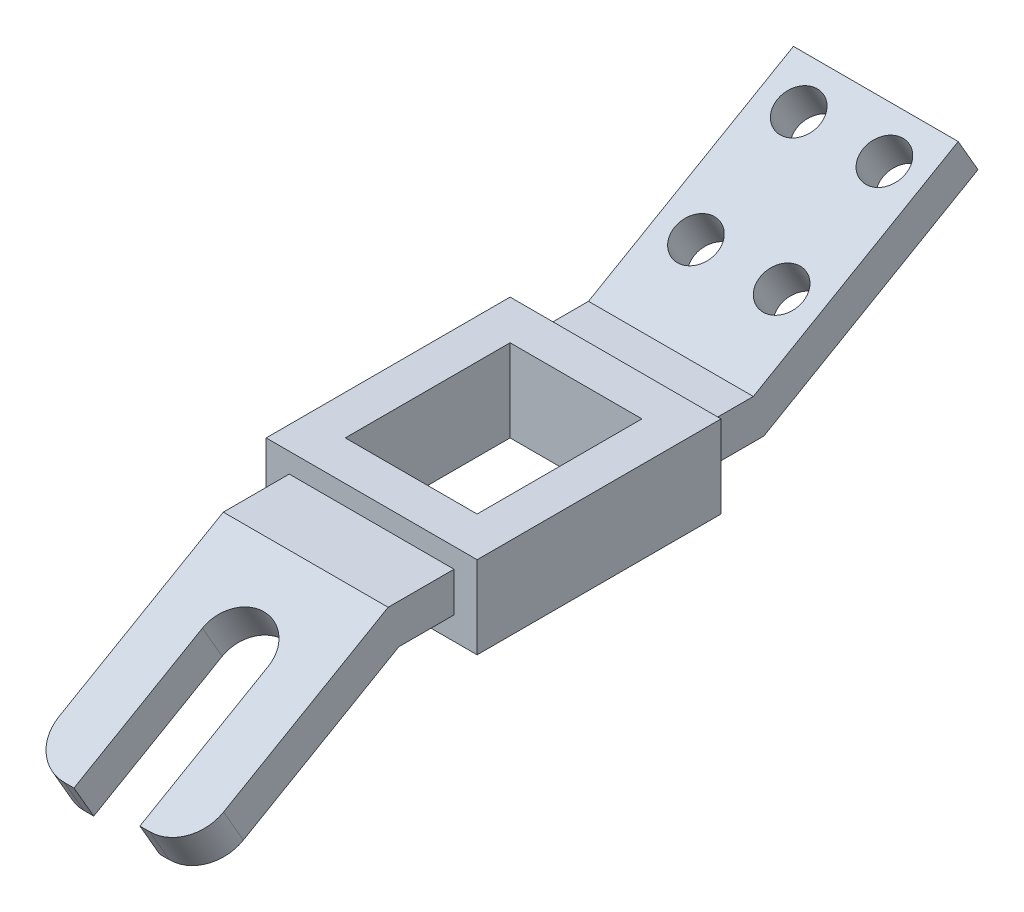
ISO-10303-21;
HEADER;
FILE_DESCRIPTION(('STEP AP214'),'2;1');
FILE_NAME('part.step','',(''),(''),'','','');
FILE_SCHEMA(('AUTOMOTIVE_DESIGN { 1 0 10303 214 1 1 1 1 }'));
ENDSEC;
DATA;
#1=APPLICATION_CONTEXT('core data for automotive mechanical design processes');
#2=APPLICATION_PROTOCOL_DEFINITION('international standard','automotive_design',2000,#1);
#3=PRODUCT_CONTEXT('',#1,'mechanical');
#4=PRODUCT('Part','Part','',(#3));
#5=PRODUCT_RELATED_PRODUCT_CATEGORY('part','',(#4));
#6=PRODUCT_DEFINITION_FORMATION('','',#4);
#7=PRODUCT_DEFINITION_CONTEXT('part definition',#1,'design');
#8=PRODUCT_DEFINITION('design','',#6,#7);
#9=PRODUCT_DEFINITION_SHAPE('','',#8);
#10=(LENGTH_UNIT() NAMED_UNIT(*) SI_UNIT(.MILLI.,.METRE.));
#11=(NAMED_UNIT(*) PLANE_ANGLE_UNIT() SI_UNIT($,.RADIAN.));
#12=(NAMED_UNIT(*) SI_UNIT($,.STERADIAN.) SOLID_ANGLE_UNIT());
#13=UNCERTAINTY_MEASURE_WITH_UNIT(LENGTH_MEASURE(1.E-05),#10,'distance_accuracy_value','');
#14=(GEOMETRIC_REPRESENTATION_CONTEXT(3) GLOBAL_UNCERTAINTY_ASSIGNED_CONTEXT((#13)) GLOBAL_UNIT_ASSIGNED_CONTEXT((#10,
#11,#12)) REPRESENTATION_CONTEXT('',''));
#15=CARTESIAN_POINT('',(0.,0.,0.));
#16=DIRECTION('',(0.,0.,1.));
#17=DIRECTION('',(1.,0.,0.));
#18=AXIS2_PLACEMENT_3D('',#15,#16,#17);
#19=CARTESIAN_POINT('',(25.,-15.821394909424,117.312425173542));
#20=DIRECTION('',(0.,0.500000000000001,-0.866025403784438));
#21=DIRECTION('',(0.,0.866025403784438,0.500000000000001));
#22=AXIS2_PLACEMENT_3D('',#19,#20,#21);
#23=PLANE('',#22);
#24=DIRECTION('',(-1.,0.,0.));
#25=VECTOR('',#24,1.);
#26=CARTESIAN_POINT('',(25.,-15.821394909424,117.312425173542));
#27=LINE('',#26,#25);
#28=CARTESIAN_POINT('',(13.,-15.821394909424,117.312425173542));
#29=VERTEX_POINT('',#28);
#30=CARTESIAN_POINT('',(10.,-15.821394909424,117.312425173542));
#31=VERTEX_POINT('',#30);
#32=EDGE_CURVE('E281',#29,#31,#27,.T.);
#33=ORIENTED_EDGE('',*,*,#32,.T.);
#34=DIRECTION('',(0.,0.866025403784438,0.500000000000001));
#35=VECTOR('',#34,1.);
#36=CARTESIAN_POINT('',(10.,-127.221300753967,52.9956595464963));
#37=LINE('',#36,#35);
#38=CARTESIAN_POINT('',(10.,-26.2136997548372,111.312425173542));
#39=VERTEX_POINT('',#38);
#40=EDGE_CURVE('E241',#39,#31,#37,.T.);
#41=ORIENTED_EDGE('',*,*,#40,.F.);
#42=DIRECTION('',(-1.,0.,0.));
#43=VECTOR('',#42,1.);
#44=CARTESIAN_POINT('',(25.,-26.2136997548372,111.312425173542));
#45=LINE('',#44,#43);
#46=CARTESIAN_POINT('',(13.,-26.2136997548372,111.312425173542));
#47=VERTEX_POINT('',#46);
#48=EDGE_CURVE('E268',#47,#39,#45,.T.);
#49=ORIENTED_EDGE('',*,*,#48,.F.);
#50=DIRECTION('',(0.,-0.866025403784438,-0.500000000000001));
#51=VECTOR('',#50,1.);
#52=CARTESIAN_POINT('',(13.,-54.7531189172804,94.8351838375902));
#53=LINE('',#52,#51);
#54=EDGE_CURVE('E417',#47,#29,#53,.F.);
#55=ORIENTED_EDGE('',*,*,#54,.T.);
#56=EDGE_LOOP('',(#33,#41,#49,#55));
#57=FACE_BOUND('',#56,.T.);
#58=ADVANCED_FACE('F38',(#57),#23,.F.);
#59=CARTESIAN_POINT('',(-13.,-48.7531189172804,84.4428789921769));
#60=DIRECTION('',(0.,0.866025403784438,0.500000000000001));
#61=DIRECTION('',(0.,-0.500000000000001,0.866025403784438));
#62=AXIS2_PLACEMENT_3D('',#59,#60,#61);
#63=CYLINDRICAL_SURFACE('',#62,12.);
#64=DIRECTION('',(0.,0.866025403784438,0.500000000000001));
#65=VECTOR('',#64,1.);
#66=CARTESIAN_POINT('',(-25.,-48.7531189172804,84.442878992177));
#67=LINE('',#66,#65);
#68=CARTESIAN_POINT('',(-25.,-20.2136997548372,100.920120328129));
#69=VERTEX_POINT('',#68);
#70=CARTESIAN_POINT('',(-25.,-9.82139490942396,106.920120328129));
#71=VERTEX_POINT('',#70);
#72=EDGE_CURVE('E424',#69,#71,#67,.T.);
#73=ORIENTED_EDGE('',*,*,#72,.F.);
#74=CARTESIAN_POINT('',(-13.,-20.2136997548372,100.920120328129));
#75=DIRECTION('',(0.,0.866025403784438,0.500000000000001));
#76=DIRECTION('',(0.,-0.500000000000001,0.866025403784438));
#77=AXIS2_PLACEMENT_3D('',#74,#75,#76);
#78=CIRCLE('',#77,12.);
#79=CARTESIAN_POINT('',(-13.,-26.2136997548372,111.312425173542));
#80=VERTEX_POINT('',#79);
#81=EDGE_CURVE('E46',#80,#69,#78,.F.);
#82=ORIENTED_EDGE('',*,*,#81,.F.);
#83=DIRECTION('',(0.,0.866025403784438,0.500000000000001));
#84=VECTOR('',#83,1.);
#85=CARTESIAN_POINT('',(-13.,-15.821394909424,117.312425173542));
#86=LINE('',#85,#84);
#87=CARTESIAN_POINT('',(-13.,-15.821394909424,117.312425173542));
#88=VERTEX_POINT('',#87);
#89=EDGE_CURVE('E427',#88,#80,#86,.F.);
#90=ORIENTED_EDGE('',*,*,#89,.F.);
#91=CARTESIAN_POINT('',(-13.,-9.82139490942397,106.920120328129));
#92=DIRECTION('',(0.,-0.866025403784438,-0.500000000000001));
#93=DIRECTION('',(0.,0.500000000000001,-0.866025403784438));
#94=AXIS2_PLACEMENT_3D('',#91,#92,#93);
#95=CIRCLE('',#94,12.);
#96=EDGE_CURVE('E11',#71,#88,#95,.F.);
#97=ORIENTED_EDGE('',*,*,#96,.F.);
#98=EDGE_LOOP('',(#73,#82,#90,#97));
#99=FACE_BOUND('',#98,.T.);
#100=ADVANCED_FACE('F40',(#99),#63,.T.);
#101=CARTESIAN_POINT('',(13.,-48.7531189172804,84.4428789921769));
#102=DIRECTION('',(0.,0.866025403784438,0.500000000000001));
#103=DIRECTION('',(0.,-0.500000000000001,0.866025403784438));
#104=AXIS2_PLACEMENT_3D('',#101,#102,#103);
#105=CYLINDRICAL_SURFACE('',#104,12.);
#106=DIRECTION('',(0.,-0.866025403784438,-0.500000000000001));
#107=VECTOR('',#106,1.);
#108=CARTESIAN_POINT('',(25.,-48.7531189172804,84.4428789921769));
#109=LINE('',#108,#107);
#110=CARTESIAN_POINT('',(25.,-9.82139490942396,106.920120328129));
#111=VERTEX_POINT('',#110);
#112=CARTESIAN_POINT('',(25.,-20.2136997548372,100.920120328129));
#113=VERTEX_POINT('',#112);
#114=EDGE_CURVE('E414',#111,#113,#109,.T.);
#115=ORIENTED_EDGE('',*,*,#114,.F.);
#116=CARTESIAN_POINT('',(13.,-9.82139490942397,106.920120328129));
#117=DIRECTION('',(0.,-0.866025403784438,-0.500000000000001));
#118=DIRECTION('',(0.,0.500000000000001,-0.866025403784438));
#119=AXIS2_PLACEMENT_3D('',#116,#117,#118);
#120=CIRCLE('',#119,12.);
#121=EDGE_CURVE('E420',#29,#111,#120,.F.);
#122=ORIENTED_EDGE('',*,*,#121,.F.);
#123=ORIENTED_EDGE('',*,*,#54,.F.);
#124=CARTESIAN_POINT('',(13.,-20.2136997548372,100.920120328129));
#125=DIRECTION('',(0.,0.866025403784438,0.500000000000001));
#126=DIRECTION('',(0.,-0.500000000000001,0.866025403784438));
#127=AXIS2_PLACEMENT_3D('',#124,#125,#126);
#128=CIRCLE('',#127,12.);
#129=EDGE_CURVE('E422',#113,#47,#128,.F.);
#130=ORIENTED_EDGE('',*,*,#129,.F.);
#131=EDGE_LOOP('',(#115,#122,#123,#130));
#132=FACE_BOUND('',#131,.T.);
#133=ADVANCED_FACE('F463',(#132),#105,.T.);
#134=CARTESIAN_POINT('',(0.,25.,0.));
#135=DIRECTION('',(0.,1.,0.));
#136=DIRECTION('',(0.,0.,1.));
#137=AXIS2_PLACEMENT_3D('',#134,#135,#136);
#138=PLANE('',#137);
#139=DIRECTION('',(0.,0.,1.));
#140=VECTOR('',#139,1.);
#141=CARTESIAN_POINT('',(-32.,25.,-37.));
#142=LINE('',#141,#140);
#143=CARTESIAN_POINT('',(-32.,25.,-37.));
#144=VERTEX_POINT('',#143);
#145=CARTESIAN_POINT('',(-32.,25.,37.));
#146=VERTEX_POINT('',#145);
#147=EDGE_CURVE('E385',#144,#146,#142,.T.);
#148=ORIENTED_EDGE('',*,*,#147,.T.);
#149=DIRECTION('',(1.,0.,0.));
#150=VECTOR('',#149,1.);
#151=CARTESIAN_POINT('',(-32.,25.,37.));
#152=LINE('',#151,#150);
#153=CARTESIAN_POINT('',(32.,25.,37.));
#154=VERTEX_POINT('',#153);
#155=EDGE_CURVE('E388',#146,#154,#152,.T.);
#156=ORIENTED_EDGE('',*,*,#155,.T.);
#157=DIRECTION('',(0.,0.,-1.));
#158=VECTOR('',#157,1.);
#159=CARTESIAN_POINT('',(32.,25.,-37.));
#160=LINE('',#159,#158);
#161=CARTESIAN_POINT('',(32.,25.,-37.));
#162=VERTEX_POINT('',#161);
#163=EDGE_CURVE('E391',#154,#162,#160,.T.);
#164=ORIENTED_EDGE('',*,*,#163,.T.);
#165=DIRECTION('',(-1.,0.,0.));
#166=VECTOR('',#165,1.);
#167=CARTESIAN_POINT('',(-32.,25.,-37.));
#168=LINE('',#167,#166);
#169=EDGE_CURVE('E393',#162,#144,#168,.T.);
#170=ORIENTED_EDGE('',*,*,#169,.T.);
#171=EDGE_LOOP('',(#148,#156,#164,#170));
#172=FACE_BOUND('',#171,.T.);
#173=DIRECTION('',(1.,0.,0.));
#174=VECTOR('',#173,1.);
#175=CARTESIAN_POINT('',(-20.,25.,25.));
#176=LINE('',#175,#174);
#177=CARTESIAN_POINT('',(-20.,25.,25.));
#178=VERTEX_POINT('',#177);
#179=CARTESIAN_POINT('',(20.,25.,25.));
#180=VERTEX_POINT('',#179);
#181=EDGE_CURVE('E356',#178,#180,#176,.T.);
#182=ORIENTED_EDGE('',*,*,#181,.F.);
#183=DIRECTION('',(0.,0.,1.));
#184=VECTOR('',#183,1.);
#185=CARTESIAN_POINT('',(-20.,25.,-25.));
#186=LINE('',#185,#184);
#187=CARTESIAN_POINT('',(-20.,25.,-25.));
#188=VERTEX_POINT('',#187);
#189=EDGE_CURVE('E354',#188,#178,#186,.T.);
#190=ORIENTED_EDGE('',*,*,#189,.F.);
#191=DIRECTION('',(-1.,0.,0.));
#192=VECTOR('',#191,1.);
#193=CARTESIAN_POINT('',(-20.,25.,-25.));
#194=LINE('',#193,#192);
#195=CARTESIAN_POINT('',(20.,25.,-25.));
#196=VERTEX_POINT('',#195);
#197=EDGE_CURVE('E362',#196,#188,#194,.T.);
#198=ORIENTED_EDGE('',*,*,#197,.F.);
#199=DIRECTION('',(0.,0.,-1.));
#200=VECTOR('',#199,1.);
#201=CARTESIAN_POINT('',(20.,25.,-25.));
#202=LINE('',#201,#200);
#203=EDGE_CURVE('E359',#180,#196,#202,.T.);
#204=ORIENTED_EDGE('',*,*,#203,.F.);
#205=EDGE_LOOP('',(#182,#190,#198,#204));
#206=FACE_BOUND('',#205,.T.);
#207=ADVANCED_FACE('F489',(#172,#206),#138,.T.);
#208=CARTESIAN_POINT('',(0.,0.,0.));
#209=DIRECTION('',(0.,1.,0.));
#210=DIRECTION('',(0.,0.,1.));
#211=AXIS2_PLACEMENT_3D('',#208,#209,#210);
#212=PLANE('',#211);
#213=DIRECTION('',(0.,0.,1.));
#214=VECTOR('',#213,1.);
#215=CARTESIAN_POINT('',(-32.,0.,-37.));
#216=LINE('',#215,#214);
#217=CARTESIAN_POINT('',(-32.,0.,-37.));
#218=VERTEX_POINT('',#217);
#219=CARTESIAN_POINT('',(-32.,0.,37.));
#220=VERTEX_POINT('',#219);
#221=EDGE_CURVE('E384',#218,#220,#216,.T.);
#222=ORIENTED_EDGE('',*,*,#221,.F.);
#223=DIRECTION('',(-1.,0.,0.));
#224=VECTOR('',#223,1.);
#225=CARTESIAN_POINT('',(-32.,0.,-37.));
#226=LINE('',#225,#224);
#227=CARTESIAN_POINT('',(32.,0.,-37.));
#228=VERTEX_POINT('',#227);
#229=EDGE_CURVE('E389',#228,#218,#226,.T.);
#230=ORIENTED_EDGE('',*,*,#229,.F.);
#231=DIRECTION('',(0.,0.,-1.));
#232=VECTOR('',#231,1.);
#233=CARTESIAN_POINT('',(32.,0.,-37.));
#234=LINE('',#233,#232);
#235=CARTESIAN_POINT('',(32.,0.,37.));
#236=VERTEX_POINT('',#235);
#237=EDGE_CURVE('E400',#236,#228,#234,.T.);
#238=ORIENTED_EDGE('',*,*,#237,.F.);
#239=DIRECTION('',(1.,0.,0.));
#240=VECTOR('',#239,1.);
#241=CARTESIAN_POINT('',(-32.,0.,37.));
#242=LINE('',#241,#240);
#243=EDGE_CURVE('E398',#220,#236,#242,.T.);
#244=ORIENTED_EDGE('',*,*,#243,.F.);
#245=EDGE_LOOP('',(#222,#230,#238,#244));
#246=FACE_BOUND('',#245,.T.);
#247=DIRECTION('',(0.,0.,1.));
#248=VECTOR('',#247,1.);
#249=CARTESIAN_POINT('',(-20.,0.,-25.));
#250=LINE('',#249,#248);
#251=CARTESIAN_POINT('',(-20.,0.,-25.));
#252=VERTEX_POINT('',#251);
#253=CARTESIAN_POINT('',(-20.,0.,25.));
#254=VERTEX_POINT('',#253);
#255=EDGE_CURVE('E353',#252,#254,#250,.T.);
#256=ORIENTED_EDGE('',*,*,#255,.T.);
#257=DIRECTION('',(1.,0.,0.));
#258=VECTOR('',#257,1.);
#259=CARTESIAN_POINT('',(-20.,0.,25.));
#260=LINE('',#259,#258);
#261=CARTESIAN_POINT('',(20.,0.,25.));
#262=VERTEX_POINT('',#261);
#263=EDGE_CURVE('E367',#254,#262,#260,.T.);
#264=ORIENTED_EDGE('',*,*,#263,.T.);
#265=DIRECTION('',(0.,0.,-1.));
#266=VECTOR('',#265,1.);
#267=CARTESIAN_POINT('',(20.,0.,-25.));
#268=LINE('',#267,#266);
#269=CARTESIAN_POINT('',(20.,0.,-25.));
#270=VERTEX_POINT('',#269);
#271=EDGE_CURVE('E370',#262,#270,#268,.T.);
#272=ORIENTED_EDGE('',*,*,#271,.T.);
#273=DIRECTION('',(-1.,0.,0.));
#274=VECTOR('',#273,1.);
#275=CARTESIAN_POINT('',(-20.,0.,-25.));
#276=LINE('',#275,#274);
#277=EDGE_CURVE('E357',#270,#252,#276,.T.);
#278=ORIENTED_EDGE('',*,*,#277,.T.);
#279=EDGE_LOOP('',(#256,#264,#272,#278));
#280=FACE_BOUND('',#279,.T.);
#281=ADVANCED_FACE('F493',(#246,#280),#212,.F.);
#282=CARTESIAN_POINT('',(-32.,25.,-37.));
#283=DIRECTION('',(1.,0.,0.));
#284=DIRECTION('',(0.,0.,-1.));
#285=AXIS2_PLACEMENT_3D('',#282,#283,#284);
#286=PLANE('',#285);
#287=ORIENTED_EDGE('',*,*,#221,.T.);
#288=DIRECTION('',(0.,-1.,0.));
#289=VECTOR('',#288,1.);
#290=CARTESIAN_POINT('',(-32.,25.,37.));
#291=LINE('',#290,#289);
#292=EDGE_CURVE('E411',#146,#220,#291,.T.);
#293=ORIENTED_EDGE('',*,*,#292,.F.);
#294=ORIENTED_EDGE('',*,*,#147,.F.);
#295=DIRECTION('',(0.,-1.,0.));
#296=VECTOR('',#295,1.);
#297=CARTESIAN_POINT('',(-32.,25.,-37.));
#298=LINE('',#297,#296);
#299=EDGE_CURVE('E395',#144,#218,#298,.T.);
#300=ORIENTED_EDGE('',*,*,#299,.T.);
#301=EDGE_LOOP('',(#287,#293,#294,#300));
#302=FACE_BOUND('',#301,.T.);
#303=ADVANCED_FACE('F497',(#302),#286,.F.);
#304=CARTESIAN_POINT('',(-32.,25.,37.));
#305=DIRECTION('',(0.,0.,-1.));
#306=DIRECTION('',(-1.,0.,0.));
#307=AXIS2_PLACEMENT_3D('',#304,#305,#306);
#308=PLANE('',#307);
#309=DIRECTION('',(-1.,0.,0.));
#310=VECTOR('',#309,1.);
#311=CARTESIAN_POINT('',(25.,7.,37.));
#312=LINE('',#311,#310);
#313=CARTESIAN_POINT('',(25.,7.,37.));
#314=VERTEX_POINT('',#313);
#315=CARTESIAN_POINT('',(-25.,7.,37.));
#316=VERTEX_POINT('',#315);
#317=EDGE_CURVE('E273',#314,#316,#312,.T.);
#318=ORIENTED_EDGE('',*,*,#317,.T.);
#319=DIRECTION('',(0.,1.,0.));
#320=VECTOR('',#319,1.);
#321=CARTESIAN_POINT('',(-25.,19.,37.));
#322=LINE('',#321,#320);
#323=CARTESIAN_POINT('',(-25.,19.,37.));
#324=VERTEX_POINT('',#323);
#325=EDGE_CURVE('E291',#316,#324,#322,.T.);
#326=ORIENTED_EDGE('',*,*,#325,.T.);
#327=DIRECTION('',(-1.,0.,0.));
#328=VECTOR('',#327,1.);
#329=CARTESIAN_POINT('',(25.,19.,37.));
#330=LINE('',#329,#328);
#331=CARTESIAN_POINT('',(25.,19.,37.));
#332=VERTEX_POINT('',#331);
#333=EDGE_CURVE('E276',#332,#324,#330,.T.);
#334=ORIENTED_EDGE('',*,*,#333,.F.);
#335=DIRECTION('',(0.,1.,0.));
#336=VECTOR('',#335,1.);
#337=CARTESIAN_POINT('',(25.,19.,37.));
#338=LINE('',#337,#336);
#339=EDGE_CURVE('E304',#314,#332,#338,.T.);
#340=ORIENTED_EDGE('',*,*,#339,.F.);
#341=EDGE_LOOP('',(#318,#326,#334,#340));
#342=FACE_BOUND('',#341,.T.);
#343=ORIENTED_EDGE('',*,*,#243,.T.);
#344=DIRECTION('',(0.,-1.,0.));
#345=VECTOR('',#344,1.);
#346=CARTESIAN_POINT('',(32.,25.,37.));
#347=LINE('',#346,#345);
#348=EDGE_CURVE('E408',#154,#236,#347,.T.);
#349=ORIENTED_EDGE('',*,*,#348,.F.);
#350=ORIENTED_EDGE('',*,*,#155,.F.);
#351=ORIENTED_EDGE('',*,*,#292,.T.);
#352=EDGE_LOOP('',(#343,#349,#350,#351));
#353=FACE_BOUND('',#352,.T.);
#354=ADVANCED_FACE('F445',(#342,#353),#308,.F.);
#355=CARTESIAN_POINT('',(32.,25.,-37.));
#356=DIRECTION('',(-1.,0.,0.));
#357=DIRECTION('',(0.,0.,1.));
#358=AXIS2_PLACEMENT_3D('',#355,#356,#357);
#359=PLANE('',#358);
#360=ORIENTED_EDGE('',*,*,#237,.T.);
#361=DIRECTION('',(0.,-1.,0.));
#362=VECTOR('',#361,1.);
#363=CARTESIAN_POINT('',(32.,25.,-37.));
#364=LINE('',#363,#362);
#365=EDGE_CURVE('E405',#162,#228,#364,.T.);
#366=ORIENTED_EDGE('',*,*,#365,.F.);
#367=ORIENTED_EDGE('',*,*,#163,.F.);
#368=ORIENTED_EDGE('',*,*,#348,.T.);
#369=EDGE_LOOP('',(#360,#366,#367,#368));
#370=FACE_BOUND('',#369,.T.);
#371=ADVANCED_FACE('F503',(#370),#359,.F.);
#372=CARTESIAN_POINT('',(-32.,25.,-37.));
#373=DIRECTION('',(0.,0.,1.));
#374=DIRECTION('',(1.,0.,0.));
#375=AXIS2_PLACEMENT_3D('',#372,#373,#374);
#376=PLANE('',#375);
#377=DIRECTION('',(-1.,0.,0.));
#378=VECTOR('',#377,1.);
#379=CARTESIAN_POINT('',(25.,19.,-37.));
#380=LINE('',#379,#378);
#381=CARTESIAN_POINT('',(25.,19.,-37.));
#382=VERTEX_POINT('',#381);
#383=CARTESIAN_POINT('',(-25.,19.,-37.));
#384=VERTEX_POINT('',#383);
#385=EDGE_CURVE('E323',#382,#384,#380,.T.);
#386=ORIENTED_EDGE('',*,*,#385,.T.);
#387=DIRECTION('',(0.,-1.,0.));
#388=VECTOR('',#387,1.);
#389=CARTESIAN_POINT('',(-25.,19.,-37.));
#390=LINE('',#389,#388);
#391=CARTESIAN_POINT('',(-25.,7.,-37.));
#392=VERTEX_POINT('',#391);
#393=EDGE_CURVE('E299',#384,#392,#390,.T.);
#394=ORIENTED_EDGE('',*,*,#393,.T.);
#395=DIRECTION('',(-1.,0.,0.));
#396=VECTOR('',#395,1.);
#397=CARTESIAN_POINT('',(25.,7.,-37.));
#398=LINE('',#397,#396);
#399=CARTESIAN_POINT('',(25.,7.,-37.));
#400=VERTEX_POINT('',#399);
#401=EDGE_CURVE('E350',#400,#392,#398,.T.);
#402=ORIENTED_EDGE('',*,*,#401,.F.);
#403=DIRECTION('',(0.,-1.,0.));
#404=VECTOR('',#403,1.);
#405=CARTESIAN_POINT('',(25.,19.,-37.));
#406=LINE('',#405,#404);
#407=EDGE_CURVE('E309',#382,#400,#406,.T.);
#408=ORIENTED_EDGE('',*,*,#407,.F.);
#409=EDGE_LOOP('',(#386,#394,#402,#408));
#410=FACE_BOUND('',#409,.T.);
#411=ORIENTED_EDGE('',*,*,#229,.T.);
#412=ORIENTED_EDGE('',*,*,#299,.F.);
#413=ORIENTED_EDGE('',*,*,#169,.F.);
#414=ORIENTED_EDGE('',*,*,#365,.T.);
#415=EDGE_LOOP('',(#411,#412,#413,#414));
#416=FACE_BOUND('',#415,.T.);
#417=ADVANCED_FACE('F506',(#410,#416),#376,.F.);
#418=CARTESIAN_POINT('',(-20.,25.,-25.));
#419=DIRECTION('',(1.,0.,0.));
#420=DIRECTION('',(0.,0.,-1.));
#421=AXIS2_PLACEMENT_3D('',#418,#419,#420);
#422=PLANE('',#421);
#423=ORIENTED_EDGE('',*,*,#255,.F.);
#424=DIRECTION('',(0.,-1.,0.));
#425=VECTOR('',#424,1.);
#426=CARTESIAN_POINT('',(-20.,25.,-25.));
#427=LINE('',#426,#425);
#428=EDGE_CURVE('E364',#188,#252,#427,.T.);
#429=ORIENTED_EDGE('',*,*,#428,.F.);
#430=ORIENTED_EDGE('',*,*,#189,.T.);
#431=DIRECTION('',(0.,-1.,0.));
#432=VECTOR('',#431,1.);
#433=CARTESIAN_POINT('',(-20.,25.,25.));
#434=LINE('',#433,#432);
#435=EDGE_CURVE('E381',#178,#254,#434,.T.);
#436=ORIENTED_EDGE('',*,*,#435,.T.);
#437=EDGE_LOOP('',(#423,#429,#430,#436));
#438=FACE_BOUND('',#437,.T.);
#439=ADVANCED_FACE('F510',(#438),#422,.T.);
#440=CARTESIAN_POINT('',(-20.,25.,25.));
#441=DIRECTION('',(0.,0.,-1.));
#442=DIRECTION('',(-1.,0.,0.));
#443=AXIS2_PLACEMENT_3D('',#440,#441,#442);
#444=PLANE('',#443);
#445=ORIENTED_EDGE('',*,*,#263,.F.);
#446=ORIENTED_EDGE('',*,*,#435,.F.);
#447=ORIENTED_EDGE('',*,*,#181,.T.);
#448=DIRECTION('',(0.,-1.,0.));
#449=VECTOR('',#448,1.);
#450=CARTESIAN_POINT('',(20.,25.,25.));
#451=LINE('',#450,#449);
#452=EDGE_CURVE('E379',#180,#262,#451,.T.);
#453=ORIENTED_EDGE('',*,*,#452,.T.);
#454=EDGE_LOOP('',(#445,#446,#447,#453));
#455=FACE_BOUND('',#454,.T.);
#456=ADVANCED_FACE('F517',(#455),#444,.T.);
#457=CARTESIAN_POINT('',(20.,25.,-25.));
#458=DIRECTION('',(-1.,0.,0.));
#459=DIRECTION('',(0.,0.,1.));
#460=AXIS2_PLACEMENT_3D('',#457,#458,#459);
#461=PLANE('',#460);
#462=ORIENTED_EDGE('',*,*,#271,.F.);
#463=ORIENTED_EDGE('',*,*,#452,.F.);
#464=ORIENTED_EDGE('',*,*,#203,.T.);
#465=DIRECTION('',(0.,-1.,0.));
#466=VECTOR('',#465,1.);
#467=CARTESIAN_POINT('',(20.,25.,-25.));
#468=LINE('',#467,#466);
#469=EDGE_CURVE('E377',#196,#270,#468,.T.);
#470=ORIENTED_EDGE('',*,*,#469,.T.);
#471=EDGE_LOOP('',(#462,#463,#464,#470));
#472=FACE_BOUND('',#471,.T.);
#473=ADVANCED_FACE('F521',(#472),#461,.T.);
#474=CARTESIAN_POINT('',(-20.,25.,-25.));
#475=DIRECTION('',(0.,0.,1.));
#476=DIRECTION('',(1.,0.,0.));
#477=AXIS2_PLACEMENT_3D('',#474,#475,#476);
#478=PLANE('',#477);
#479=ORIENTED_EDGE('',*,*,#277,.F.);
#480=ORIENTED_EDGE('',*,*,#469,.F.);
#481=ORIENTED_EDGE('',*,*,#197,.T.);
#482=ORIENTED_EDGE('',*,*,#428,.T.);
#483=EDGE_LOOP('',(#479,#480,#481,#482));
#484=FACE_BOUND('',#483,.T.);
#485=ADVANCED_FACE('F525',(#484),#478,.T.);
#486=CARTESIAN_POINT('',(25.,7.,-57.));
#487=DIRECTION('',(0.,1.,0.));
#488=DIRECTION('',(0.,0.,1.));
#489=AXIS2_PLACEMENT_3D('',#486,#487,#488);
#490=PLANE('',#489);
#491=DIRECTION('',(0.,0.,-1.));
#492=VECTOR('',#491,1.);
#493=CARTESIAN_POINT('',(-25.,7.,-57.));
#494=LINE('',#493,#492);
#495=CARTESIAN_POINT('',(-25.,7.,-57.));
#496=VERTEX_POINT('',#495);
#497=EDGE_CURVE('E326',#392,#496,#494,.T.);
#498=ORIENTED_EDGE('',*,*,#497,.T.);
#499=DIRECTION('',(-1.,0.,0.));
#500=VECTOR('',#499,1.);
#501=CARTESIAN_POINT('',(25.,7.,-57.));
#502=LINE('',#501,#500);
#503=CARTESIAN_POINT('',(25.,7.,-57.));
#504=VERTEX_POINT('',#503);
#505=EDGE_CURVE('E347',#504,#496,#502,.T.);
#506=ORIENTED_EDGE('',*,*,#505,.F.);
#507=DIRECTION('',(0.,0.,-1.));
#508=VECTOR('',#507,1.);
#509=CARTESIAN_POINT('',(25.,7.,-57.));
#510=LINE('',#509,#508);
#511=EDGE_CURVE('E312',#400,#504,#510,.T.);
#512=ORIENTED_EDGE('',*,*,#511,.F.);
#513=ORIENTED_EDGE('',*,*,#401,.T.);
#514=EDGE_LOOP('',(#498,#506,#512,#513));
#515=FACE_BOUND('',#514,.T.);
#516=ADVANCED_FACE('F529',(#515),#490,.F.);
#517=CARTESIAN_POINT('',(25.,44.5000000000001,-121.951905283833));
#518=DIRECTION('',(0.,0.866025403784438,0.500000000000001));
#519=DIRECTION('',(0.,-0.500000000000001,0.866025403784438));
#520=AXIS2_PLACEMENT_3D('',#517,#518,#519);
#521=PLANE('',#520);
#522=CARTESIAN_POINT('',(13.,38.5000000000001,-111.55960043842));
#523=DIRECTION('',(0.,0.866025403784438,0.500000000000001));
#524=DIRECTION('',(0.,-0.500000000000001,0.866025403784438));
#525=AXIS2_PLACEMENT_3D('',#522,#523,#524);
#526=CIRCLE('',#525,6.5);
#527=CARTESIAN_POINT('',(13.,35.2500000000001,-105.930435313821));
#528=VERTEX_POINT('',#527);
#529=EDGE_CURVE('E250',#528,#528,#526,.F.);
#530=ORIENTED_EDGE('',*,*,#529,.F.);
#531=EDGE_LOOP('',(#530));
#532=FACE_BOUND('',#531,.T.);
#533=CARTESIAN_POINT('',(-13.,20.5000000000001,-80.3826859021798));
#534=DIRECTION('',(0.,0.866025403784438,0.500000000000001));
#535=DIRECTION('',(0.,-0.500000000000001,0.866025403784438));
#536=AXIS2_PLACEMENT_3D('',#533,#534,#535);
#537=CIRCLE('',#536,6.50000000000001);
#538=CARTESIAN_POINT('',(-13.,17.25,-74.753520777581));
#539=VERTEX_POINT('',#538);
#540=EDGE_CURVE('E249',#539,#539,#537,.F.);
#541=ORIENTED_EDGE('',*,*,#540,.F.);
#542=EDGE_LOOP('',(#541));
#543=FACE_BOUND('',#542,.T.);
#544=CARTESIAN_POINT('',(13.,20.5000000000001,-80.3826859021798));
#545=DIRECTION('',(0.,0.866025403784438,0.500000000000001));
#546=DIRECTION('',(0.,-0.500000000000001,0.866025403784438));
#547=AXIS2_PLACEMENT_3D('',#544,#545,#546);
#548=CIRCLE('',#547,6.5);
#549=CARTESIAN_POINT('',(13.,17.25,-74.753520777581));
#550=VERTEX_POINT('',#549);
#551=EDGE_CURVE('E226',#550,#550,#548,.F.);
#552=ORIENTED_EDGE('',*,*,#551,.F.);
#553=EDGE_LOOP('',(#552));
#554=FACE_BOUND('',#553,.T.);
#555=CARTESIAN_POINT('',(-13.,38.5000000000001,-111.55960043842));
#556=DIRECTION('',(0.,0.866025403784438,0.500000000000001));
#557=DIRECTION('',(0.,-0.500000000000001,0.866025403784438));
#558=AXIS2_PLACEMENT_3D('',#555,#556,#557);
#559=CIRCLE('',#558,6.50000000000001);
#560=CARTESIAN_POINT('',(-13.,35.2500000000001,-105.930435313821));
#561=VERTEX_POINT('',#560);
#562=EDGE_CURVE('E264',#561,#561,#559,.F.);
#563=ORIENTED_EDGE('',*,*,#562,.F.);
#564=EDGE_LOOP('',(#563));
#565=FACE_BOUND('',#564,.T.);
#566=DIRECTION('',(0.,0.500000000000001,-0.866025403784438));
#567=VECTOR('',#566,1.);
#568=CARTESIAN_POINT('',(-25.,44.5000000000001,-121.951905283833));
#569=LINE('',#568,#567);
#570=CARTESIAN_POINT('',(-25.,44.5000000000001,-121.951905283833));
#571=VERTEX_POINT('',#570);
#572=EDGE_CURVE('E328',#496,#571,#569,.T.);
#573=ORIENTED_EDGE('',*,*,#572,.T.);
#574=DIRECTION('',(-1.,0.,0.));
#575=VECTOR('',#574,1.);
#576=CARTESIAN_POINT('',(25.,44.5000000000001,-121.951905283833));
#577=LINE('',#576,#575);
#578=CARTESIAN_POINT('',(25.,44.5000000000001,-121.951905283833));
#579=VERTEX_POINT('',#578);
#580=EDGE_CURVE('E344',#579,#571,#577,.T.);
#581=ORIENTED_EDGE('',*,*,#580,.F.);
#582=DIRECTION('',(0.,0.500000000000001,-0.866025403784438));
#583=VECTOR('',#582,1.);
#584=CARTESIAN_POINT('',(25.,44.5000000000001,-121.951905283833));
#585=LINE('',#584,#583);
#586=EDGE_CURVE('E315',#504,#579,#585,.T.);
#587=ORIENTED_EDGE('',*,*,#586,.F.);
#588=ORIENTED_EDGE('',*,*,#505,.T.);
#589=EDGE_LOOP('',(#573,#581,#587,#588));
#590=FACE_BOUND('',#589,.T.);
#591=ADVANCED_FACE('F533',(#532,#543,#554,#565,#590),#521,.F.);
#592=CARTESIAN_POINT('',(25.,54.8923048454134,-115.951905283833));
#593=DIRECTION('',(0.,-0.500000000000002,0.866025403784438));
#594=DIRECTION('',(0.,-0.866025403784438,-0.500000000000002));
#595=AXIS2_PLACEMENT_3D('',#592,#593,#594);
#596=PLANE('',#595);
#597=DIRECTION('',(0.,0.866025403784438,0.500000000000002));
#598=VECTOR('',#597,1.);
#599=CARTESIAN_POINT('',(-25.,54.8923048454134,-115.951905283833));
#600=LINE('',#599,#598);
#601=CARTESIAN_POINT('',(-25.,54.8923048454134,-115.951905283833));
#602=VERTEX_POINT('',#601);
#603=EDGE_CURVE('E330',#571,#602,#600,.T.);
#604=ORIENTED_EDGE('',*,*,#603,.T.);
#605=DIRECTION('',(-1.,0.,0.));
#606=VECTOR('',#605,1.);
#607=CARTESIAN_POINT('',(25.,54.8923048454134,-115.951905283833));
#608=LINE('',#607,#606);
#609=CARTESIAN_POINT('',(25.,54.8923048454134,-115.951905283833));
#610=VERTEX_POINT('',#609);
#611=EDGE_CURVE('E341',#610,#602,#608,.T.);
#612=ORIENTED_EDGE('',*,*,#611,.F.);
#613=DIRECTION('',(0.,0.866025403784438,0.500000000000002));
#614=VECTOR('',#613,1.);
#615=CARTESIAN_POINT('',(25.,54.8923048454134,-115.951905283833));
#616=LINE('',#615,#614);
#617=EDGE_CURVE('E317',#579,#610,#616,.T.);
#618=ORIENTED_EDGE('',*,*,#617,.F.);
#619=ORIENTED_EDGE('',*,*,#580,.T.);
#620=EDGE_LOOP('',(#604,#612,#618,#619));
#621=FACE_BOUND('',#620,.T.);
#622=ADVANCED_FACE('F537',(#621),#596,.F.);
#623=CARTESIAN_POINT('',(25.,19.,-53.7846096908265));
#624=DIRECTION('',(0.,-0.866025403784438,-0.500000000000001));
#625=DIRECTION('',(0.,0.500000000000001,-0.866025403784438));
#626=AXIS2_PLACEMENT_3D('',#623,#624,#625);
#627=PLANE('',#626);
#628=CARTESIAN_POINT('',(13.,48.8923048454133,-105.55960043842));
#629=DIRECTION('',(0.,0.866025403784438,0.500000000000002));
#630=DIRECTION('',(0.,-0.500000000000001,0.866025403784438));
#631=AXIS2_PLACEMENT_3D('',#628,#629,#630);
#632=CIRCLE('',#631,6.5);
#633=CARTESIAN_POINT('',(13.,45.6423048454133,-99.9304353138207));
#634=VERTEX_POINT('',#633);
#635=EDGE_CURVE('E253',#634,#634,#632,.T.);
#636=ORIENTED_EDGE('',*,*,#635,.F.);
#637=EDGE_LOOP('',(#636));
#638=FACE_BOUND('',#637,.T.);
#639=CARTESIAN_POINT('',(-13.,30.8923048454133,-74.3826859021798));
#640=DIRECTION('',(0.,0.866025403784438,0.500000000000002));
#641=DIRECTION('',(0.,-0.500000000000001,0.866025403784438));
#642=AXIS2_PLACEMENT_3D('',#639,#640,#641);
#643=CIRCLE('',#642,6.50000000000001);
#644=CARTESIAN_POINT('',(-13.,27.6423048454133,-68.753520777581));
#645=VERTEX_POINT('',#644);
#646=EDGE_CURVE('E254',#645,#645,#643,.T.);
#647=ORIENTED_EDGE('',*,*,#646,.F.);
#648=EDGE_LOOP('',(#647));
#649=FACE_BOUND('',#648,.T.);
#650=CARTESIAN_POINT('',(13.,30.8923048454133,-74.3826859021798));
#651=DIRECTION('',(0.,0.866025403784438,0.500000000000002));
#652=DIRECTION('',(0.,-0.500000000000001,0.866025403784438));
#653=AXIS2_PLACEMENT_3D('',#650,#651,#652);
#654=CIRCLE('',#653,6.5);
#655=CARTESIAN_POINT('',(13.,27.6423048454133,-68.753520777581));
#656=VERTEX_POINT('',#655);
#657=EDGE_CURVE('E246',#656,#656,#654,.T.);
#658=ORIENTED_EDGE('',*,*,#657,.F.);
#659=EDGE_LOOP('',(#658));
#660=FACE_BOUND('',#659,.T.);
#661=CARTESIAN_POINT('',(-13.,48.8923048454133,-105.55960043842));
#662=DIRECTION('',(0.,0.866025403784438,0.500000000000002));
#663=DIRECTION('',(0.,-0.500000000000001,0.866025403784438));
#664=AXIS2_PLACEMENT_3D('',#661,#662,#663);
#665=CIRCLE('',#664,6.50000000000001);
#666=CARTESIAN_POINT('',(-13.,45.6423048454133,-99.9304353138207));
#667=VERTEX_POINT('',#666);
#668=EDGE_CURVE('E257',#667,#667,#665,.T.);
#669=ORIENTED_EDGE('',*,*,#668,.F.);
#670=EDGE_LOOP('',(#669));
#671=FACE_BOUND('',#670,.T.);
#672=DIRECTION('',(0.,-0.500000000000001,0.866025403784438));
#673=VECTOR('',#672,1.);
#674=CARTESIAN_POINT('',(-25.,19.,-53.7846096908265));
#675=LINE('',#674,#673);
#676=CARTESIAN_POINT('',(-25.,19.,-53.7846096908265));
#677=VERTEX_POINT('',#676);
#678=EDGE_CURVE('E332',#602,#677,#675,.T.);
#679=ORIENTED_EDGE('',*,*,#678,.T.);
#680=DIRECTION('',(-1.,0.,0.));
#681=VECTOR('',#680,1.);
#682=CARTESIAN_POINT('',(25.,19.,-53.7846096908265));
#683=LINE('',#682,#681);
#684=CARTESIAN_POINT('',(25.,19.,-53.7846096908265));
#685=VERTEX_POINT('',#684);
#686=EDGE_CURVE('E338',#685,#677,#683,.T.);
#687=ORIENTED_EDGE('',*,*,#686,.F.);
#688=DIRECTION('',(0.,-0.500000000000001,0.866025403784438));
#689=VECTOR('',#688,1.);
#690=CARTESIAN_POINT('',(25.,19.,-53.7846096908265));
#691=LINE('',#690,#689);
#692=EDGE_CURVE('E319',#610,#685,#691,.T.);
#693=ORIENTED_EDGE('',*,*,#692,.F.);
#694=ORIENTED_EDGE('',*,*,#611,.T.);
#695=EDGE_LOOP('',(#679,#687,#693,#694));
#696=FACE_BOUND('',#695,.T.);
#697=ADVANCED_FACE('F541',(#638,#649,#660,#671,#696),#627,.F.);
#698=CARTESIAN_POINT('',(25.,19.,-37.));
#699=DIRECTION('',(0.,-1.,0.));
#700=DIRECTION('',(0.,0.,-1.));
#701=AXIS2_PLACEMENT_3D('',#698,#699,#700);
#702=PLANE('',#701);
#703=DIRECTION('',(0.,0.,1.));
#704=VECTOR('',#703,1.);
#705=CARTESIAN_POINT('',(-25.,19.,-37.));
#706=LINE('',#705,#704);
#707=EDGE_CURVE('E313',#677,#384,#706,.T.);
#708=ORIENTED_EDGE('',*,*,#707,.T.);
#709=ORIENTED_EDGE('',*,*,#385,.F.);
#710=DIRECTION('',(0.,0.,1.));
#711=VECTOR('',#710,1.);
#712=CARTESIAN_POINT('',(25.,19.,-37.));
#713=LINE('',#712,#711);
#714=EDGE_CURVE('E321',#685,#382,#713,.T.);
#715=ORIENTED_EDGE('',*,*,#714,.F.);
#716=ORIENTED_EDGE('',*,*,#686,.T.);
#717=EDGE_LOOP('',(#708,#709,#715,#716));
#718=FACE_BOUND('',#717,.T.);
#719=ADVANCED_FACE('F545',(#718),#702,.F.);
#720=CARTESIAN_POINT('',(25.,0.,0.));
#721=DIRECTION('',(-1.,0.,0.));
#722=DIRECTION('',(0.,0.,1.));
#723=AXIS2_PLACEMENT_3D('',#720,#721,#722);
#724=PLANE('',#723);
#725=ORIENTED_EDGE('',*,*,#407,.T.);
#726=ORIENTED_EDGE('',*,*,#511,.T.);
#727=ORIENTED_EDGE('',*,*,#586,.T.);
#728=ORIENTED_EDGE('',*,*,#617,.T.);
#729=ORIENTED_EDGE('',*,*,#692,.T.);
#730=ORIENTED_EDGE('',*,*,#714,.T.);
#731=EDGE_LOOP('',(#725,#726,#727,#728,#729,#730));
#732=FACE_BOUND('',#731,.T.);
#733=ADVANCED_FACE('F478',(#732),#724,.F.);
#734=CARTESIAN_POINT('',(-25.,0.,0.));
#735=DIRECTION('',(-1.,0.,0.));
#736=DIRECTION('',(0.,0.,1.));
#737=AXIS2_PLACEMENT_3D('',#734,#735,#736);
#738=PLANE('',#737);
#739=ORIENTED_EDGE('',*,*,#393,.F.);
#740=ORIENTED_EDGE('',*,*,#707,.F.);
#741=ORIENTED_EDGE('',*,*,#678,.F.);
#742=ORIENTED_EDGE('',*,*,#603,.F.);
#743=ORIENTED_EDGE('',*,*,#572,.F.);
#744=ORIENTED_EDGE('',*,*,#497,.F.);
#745=EDGE_LOOP('',(#739,#740,#741,#742,#743,#744));
#746=FACE_BOUND('',#745,.T.);
#747=ADVANCED_FACE('F471',(#746),#738,.T.);
#748=CARTESIAN_POINT('',(-9.99999999999999,-26.2136997548372,111.312425173542));
#749=VERTEX_POINT('',#748);
#750=EDGE_CURVE('E267',#749,#80,#45,.T.);
#751=ORIENTED_EDGE('',*,*,#750,.F.);
#752=DIRECTION('',(0.,0.866025403784438,0.500000000000001));
#753=VECTOR('',#752,1.);
#754=CARTESIAN_POINT('',(-9.99999999999999,-127.221300753967,52.9956595464963));
#755=LINE('',#754,#753);
#756=CARTESIAN_POINT('',(-9.99999999999999,-15.821394909424,117.312425173542));
#757=VERTEX_POINT('',#756);
#758=EDGE_CURVE('E218',#749,#757,#755,.T.);
#759=ORIENTED_EDGE('',*,*,#758,.T.);
#760=EDGE_CURVE('E61',#757,#88,#27,.T.);
#761=ORIENTED_EDGE('',*,*,#760,.T.);
#762=ORIENTED_EDGE('',*,*,#89,.T.);
#763=EDGE_LOOP('',(#751,#759,#761,#762));
#764=FACE_BOUND('',#763,.T.);
#765=ADVANCED_FACE('F469',(#764),#23,.F.);
#766=CARTESIAN_POINT('',(25.,-26.2136997548372,111.312425173542));
#767=DIRECTION('',(0.,0.866025403784438,0.500000000000001));
#768=DIRECTION('',(0.,-0.500000000000001,0.866025403784438));
#769=AXIS2_PLACEMENT_3D('',#766,#767,#768);
#770=PLANE('',#769);
#771=ORIENTED_EDGE('',*,*,#48,.T.);
#772=DIRECTION('',(0.,-0.500000000000001,0.866025403784438));
#773=VECTOR('',#772,1.);
#774=CARTESIAN_POINT('',(10.,-3.71369975483717,72.3412820032426));
#775=LINE('',#774,#773);
#776=CARTESIAN_POINT('',(10.,-3.71369975483718,72.3412820032426));
#777=VERTEX_POINT('',#776);
#778=EDGE_CURVE('E231',#777,#39,#775,.T.);
#779=ORIENTED_EDGE('',*,*,#778,.F.);
#780=CARTESIAN_POINT('',(0.,-3.71369975483717,72.3412820032426));
#781=DIRECTION('',(0.,0.866025403784438,0.500000000000001));
#782=DIRECTION('',(0.,-0.500000000000001,0.866025403784438));
#783=AXIS2_PLACEMENT_3D('',#780,#781,#782);
#784=CIRCLE('',#783,10.);
#785=CARTESIAN_POINT('',(-10.,-3.71369975483718,72.3412820032426));
#786=VERTEX_POINT('',#785);
#787=EDGE_CURVE('E214',#786,#777,#784,.F.);
#788=ORIENTED_EDGE('',*,*,#787,.F.);
#789=DIRECTION('',(0.,0.500000000000001,-0.866025403784438));
#790=VECTOR('',#789,1.);
#791=CARTESIAN_POINT('',(-10.,-3.71369975483717,72.3412820032426));
#792=LINE('',#791,#790);
#793=EDGE_CURVE('E222',#749,#786,#792,.T.);
#794=ORIENTED_EDGE('',*,*,#793,.F.);
#795=ORIENTED_EDGE('',*,*,#750,.T.);
#796=ORIENTED_EDGE('',*,*,#81,.T.);
#797=DIRECTION('',(0.,0.500000000000001,-0.866025403784438));
#798=VECTOR('',#797,1.);
#799=CARTESIAN_POINT('',(-25.,-26.2136997548372,111.312425173542));
#800=LINE('',#799,#798);
#801=CARTESIAN_POINT('',(-25.,6.99999999999999,53.7846096908265));
#802=VERTEX_POINT('',#801);
#803=EDGE_CURVE('E297',#69,#802,#800,.T.);
#804=ORIENTED_EDGE('',*,*,#803,.T.);
#805=DIRECTION('',(-1.,0.,0.));
#806=VECTOR('',#805,1.);
#807=CARTESIAN_POINT('',(25.,6.99999999999999,53.7846096908265));
#808=LINE('',#807,#806);
#809=CARTESIAN_POINT('',(25.,6.99999999999999,53.7846096908265));
#810=VERTEX_POINT('',#809);
#811=EDGE_CURVE('E270',#810,#802,#808,.T.);
#812=ORIENTED_EDGE('',*,*,#811,.F.);
#813=DIRECTION('',(0.,0.500000000000001,-0.866025403784438));
#814=VECTOR('',#813,1.);
#815=CARTESIAN_POINT('',(25.,-26.2136997548372,111.312425173542));
#816=LINE('',#815,#814);
#817=EDGE_CURVE('E289',#113,#810,#816,.T.);
#818=ORIENTED_EDGE('',*,*,#817,.F.);
#819=ORIENTED_EDGE('',*,*,#129,.T.);
#820=EDGE_LOOP('',(#771,#779,#788,#794,#795,#796,#804,#812,#818,#819));
#821=FACE_BOUND('',#820,.T.);
#822=ADVANCED_FACE('F230',(#821),#770,.F.);
#823=CARTESIAN_POINT('',(25.,6.99999999999999,53.7846096908265));
#824=DIRECTION('',(0.,1.,0.));
#825=DIRECTION('',(0.,0.,1.));
#826=AXIS2_PLACEMENT_3D('',#823,#824,#825);
#827=PLANE('',#826);
#828=DIRECTION('',(0.,0.,-1.));
#829=VECTOR('',#828,1.);
#830=CARTESIAN_POINT('',(-25.,6.99999999999999,53.7846096908265));
#831=LINE('',#830,#829);
#832=EDGE_CURVE('E294',#802,#316,#831,.T.);
#833=ORIENTED_EDGE('',*,*,#832,.T.);
#834=ORIENTED_EDGE('',*,*,#317,.F.);
#835=DIRECTION('',(0.,0.,-1.));
#836=VECTOR('',#835,1.);
#837=CARTESIAN_POINT('',(25.,6.99999999999999,53.7846096908265));
#838=LINE('',#837,#836);
#839=EDGE_CURVE('E306',#810,#314,#838,.T.);
#840=ORIENTED_EDGE('',*,*,#839,.F.);
#841=ORIENTED_EDGE('',*,*,#811,.T.);
#842=EDGE_LOOP('',(#833,#834,#840,#841));
#843=FACE_BOUND('',#842,.T.);
#844=ADVANCED_FACE('F441',(#843),#827,.F.);
#845=CARTESIAN_POINT('',(25.,19.,37.));
#846=DIRECTION('',(0.,-1.,0.));
#847=DIRECTION('',(0.,0.,-1.));
#848=AXIS2_PLACEMENT_3D('',#845,#846,#847);
#849=PLANE('',#848);
#850=DIRECTION('',(0.,0.,1.));
#851=VECTOR('',#850,1.);
#852=CARTESIAN_POINT('',(-25.,19.,37.));
#853=LINE('',#852,#851);
#854=CARTESIAN_POINT('',(-25.,19.,57.));
#855=VERTEX_POINT('',#854);
#856=EDGE_CURVE('E288',#324,#855,#853,.T.);
#857=ORIENTED_EDGE('',*,*,#856,.T.);
#858=DIRECTION('',(-1.,0.,0.));
#859=VECTOR('',#858,1.);
#860=CARTESIAN_POINT('',(25.,19.,57.));
#861=LINE('',#860,#859);
#862=CARTESIAN_POINT('',(25.,19.,57.));
#863=VERTEX_POINT('',#862);
#864=EDGE_CURVE('E278',#863,#855,#861,.T.);
#865=ORIENTED_EDGE('',*,*,#864,.F.);
#866=DIRECTION('',(0.,0.,1.));
#867=VECTOR('',#866,1.);
#868=CARTESIAN_POINT('',(25.,19.,37.));
#869=LINE('',#868,#867);
#870=EDGE_CURVE('E302',#332,#863,#869,.T.);
#871=ORIENTED_EDGE('',*,*,#870,.F.);
#872=ORIENTED_EDGE('',*,*,#333,.T.);
#873=EDGE_LOOP('',(#857,#865,#871,#872));
#874=FACE_BOUND('',#873,.T.);
#875=ADVANCED_FACE('F453',(#874),#849,.F.);
#876=CARTESIAN_POINT('',(25.,19.,57.));
#877=DIRECTION('',(0.,-0.866025403784438,-0.500000000000001));
#878=DIRECTION('',(0.,0.500000000000001,-0.866025403784438));
#879=AXIS2_PLACEMENT_3D('',#876,#877,#878);
#880=PLANE('',#879);
#881=CARTESIAN_POINT('',(0.,6.67860509057608,78.3412820032426));
#882=DIRECTION('',(0.,0.866025403784438,0.500000000000002));
#883=DIRECTION('',(0.,-0.500000000000001,0.866025403784438));
#884=AXIS2_PLACEMENT_3D('',#881,#882,#883);
#885=CIRCLE('',#884,10.);
#886=CARTESIAN_POINT('',(10.,6.67860509057608,78.3412820032426));
#887=VERTEX_POINT('',#886);
#888=CARTESIAN_POINT('',(-10.,6.67860509057608,78.3412820032427));
#889=VERTEX_POINT('',#888);
#890=EDGE_CURVE('E53',#887,#889,#885,.T.);
#891=ORIENTED_EDGE('',*,*,#890,.F.);
#892=DIRECTION('',(0.,0.500000000000001,-0.866025403784438));
#893=VECTOR('',#892,1.);
#894=CARTESIAN_POINT('',(10.,6.67860509057608,78.3412820032426));
#895=LINE('',#894,#893);
#896=EDGE_CURVE('E219',#31,#887,#895,.T.);
#897=ORIENTED_EDGE('',*,*,#896,.F.);
#898=ORIENTED_EDGE('',*,*,#32,.F.);
#899=ORIENTED_EDGE('',*,*,#121,.T.);
#900=DIRECTION('',(0.,-0.500000000000001,0.866025403784438));
#901=VECTOR('',#900,1.);
#902=CARTESIAN_POINT('',(25.,19.,57.));
#903=LINE('',#902,#901);
#904=EDGE_CURVE('E284',#863,#111,#903,.T.);
#905=ORIENTED_EDGE('',*,*,#904,.F.);
#906=ORIENTED_EDGE('',*,*,#864,.T.);
#907=DIRECTION('',(0.,-0.500000000000001,0.866025403784438));
#908=VECTOR('',#907,1.);
#909=CARTESIAN_POINT('',(-25.,19.,57.));
#910=LINE('',#909,#908);
#911=EDGE_CURVE('E285',#855,#71,#910,.T.);
#912=ORIENTED_EDGE('',*,*,#911,.T.);
#913=ORIENTED_EDGE('',*,*,#96,.T.);
#914=ORIENTED_EDGE('',*,*,#760,.F.);
#915=DIRECTION('',(0.,-0.500000000000001,0.866025403784438));
#916=VECTOR('',#915,1.);
#917=CARTESIAN_POINT('',(-10.,6.67860509057608,78.3412820032426));
#918=LINE('',#917,#916);
#919=EDGE_CURVE('E236',#889,#757,#918,.T.);
#920=ORIENTED_EDGE('',*,*,#919,.F.);
#921=EDGE_LOOP('',(#891,#897,#898,#899,#905,#906,#912,#913,#914,#920));
#922=FACE_BOUND('',#921,.T.);
#923=ADVANCED_FACE('F456',(#922),#880,.F.);
#924=CARTESIAN_POINT('',(25.,0.,0.));
#925=DIRECTION('',(1.,0.,0.));
#926=DIRECTION('',(0.,0.,-1.));
#927=AXIS2_PLACEMENT_3D('',#924,#925,#926);
#928=PLANE('',#927);
#929=ORIENTED_EDGE('',*,*,#904,.T.);
#930=ORIENTED_EDGE('',*,*,#114,.T.);
#931=ORIENTED_EDGE('',*,*,#817,.T.);
#932=ORIENTED_EDGE('',*,*,#839,.T.);
#933=ORIENTED_EDGE('',*,*,#339,.T.);
#934=ORIENTED_EDGE('',*,*,#870,.T.);
#935=EDGE_LOOP('',(#929,#930,#931,#932,#933,#934));
#936=FACE_BOUND('',#935,.T.);
#937=ADVANCED_FACE('F450',(#936),#928,.T.);
#938=CARTESIAN_POINT('',(-25.,0.,0.));
#939=DIRECTION('',(1.,0.,0.));
#940=DIRECTION('',(0.,0.,-1.));
#941=AXIS2_PLACEMENT_3D('',#938,#939,#940);
#942=PLANE('',#941);
#943=ORIENTED_EDGE('',*,*,#803,.F.);
#944=ORIENTED_EDGE('',*,*,#72,.T.);
#945=ORIENTED_EDGE('',*,*,#911,.F.);
#946=ORIENTED_EDGE('',*,*,#856,.F.);
#947=ORIENTED_EDGE('',*,*,#325,.F.);
#948=ORIENTED_EDGE('',*,*,#832,.F.);
#949=EDGE_LOOP('',(#943,#944,#945,#946,#947,#948));
#950=FACE_BOUND('',#949,.T.);
#951=ADVANCED_FACE('F437',(#950),#942,.F.);
#952=CARTESIAN_POINT('',(-13.,-14.5364578288297,-142.180213642759));
#953=DIRECTION('',(0.,0.866025403784438,0.500000000000002));
#954=DIRECTION('',(0.,-0.500000000000002,0.866025403784438));
#955=AXIS2_PLACEMENT_3D('',#952,#953,#954);
#956=CYLINDRICAL_SURFACE('',#955,6.50000000000001);
#957=ORIENTED_EDGE('',*,*,#668,.T.);
#958=EDGE_LOOP('',(#957));
#959=FACE_BOUND('',#958,.T.);
#960=ORIENTED_EDGE('',*,*,#562,.T.);
#961=EDGE_LOOP('',(#960));
#962=FACE_BOUND('',#961,.T.);
#963=ADVANCED_FACE('F557',(#959,#962),#956,.F.);
#964=CARTESIAN_POINT('',(13.,-32.5364578288298,-111.003299106519));
#965=DIRECTION('',(0.,0.866025403784438,0.500000000000002));
#966=DIRECTION('',(0.,-0.500000000000002,0.866025403784438));
#967=AXIS2_PLACEMENT_3D('',#964,#965,#966);
#968=CYLINDRICAL_SURFACE('',#967,6.5);
#969=ORIENTED_EDGE('',*,*,#657,.T.);
#970=EDGE_LOOP('',(#969));
#971=FACE_BOUND('',#970,.T.);
#972=ORIENTED_EDGE('',*,*,#551,.T.);
#973=EDGE_LOOP('',(#972));
#974=FACE_BOUND('',#973,.T.);
#975=ADVANCED_FACE('F592',(#971,#974),#968,.F.);
#976=CARTESIAN_POINT('',(-13.,-32.5364578288298,-111.003299106519));
#977=DIRECTION('',(0.,0.866025403784438,0.500000000000002));
#978=DIRECTION('',(0.,-0.500000000000002,0.866025403784438));
#979=AXIS2_PLACEMENT_3D('',#976,#977,#978);
#980=CYLINDRICAL_SURFACE('',#979,6.50000000000001);
#981=ORIENTED_EDGE('',*,*,#646,.T.);
#982=EDGE_LOOP('',(#981));
#983=FACE_BOUND('',#982,.T.);
#984=ORIENTED_EDGE('',*,*,#540,.T.);
#985=EDGE_LOOP('',(#984));
#986=FACE_BOUND('',#985,.T.);
#987=ADVANCED_FACE('F600',(#983,#986),#980,.F.);
#988=CARTESIAN_POINT('',(13.,-14.5364578288297,-142.180213642759));
#989=DIRECTION('',(0.,0.866025403784438,0.500000000000002));
#990=DIRECTION('',(0.,-0.500000000000002,0.866025403784438));
#991=AXIS2_PLACEMENT_3D('',#988,#989,#990);
#992=CYLINDRICAL_SURFACE('',#991,6.5);
#993=ORIENTED_EDGE('',*,*,#635,.T.);
#994=EDGE_LOOP('',(#993));
#995=FACE_BOUND('',#994,.T.);
#996=ORIENTED_EDGE('',*,*,#529,.T.);
#997=EDGE_LOOP('',(#996));
#998=FACE_BOUND('',#997,.T.);
#999=ADVANCED_FACE('F608',(#995,#998),#992,.F.);
#1000=CARTESIAN_POINT('',(0.,-104.721300753967,14.0245163761966));
#1001=DIRECTION('',(0.,0.866025403784438,0.500000000000001));
#1002=DIRECTION('',(0.,-0.500000000000002,0.866025403784438));
#1003=AXIS2_PLACEMENT_3D('',#1000,#1001,#1002);
#1004=CYLINDRICAL_SURFACE('',#1003,10.);
#1005=ORIENTED_EDGE('',*,*,#787,.T.);
#1006=DIRECTION('',(0.,0.866025403784438,0.500000000000001));
#1007=VECTOR('',#1006,1.);
#1008=CARTESIAN_POINT('',(10.,-104.721300753967,14.0245163761966));
#1009=LINE('',#1008,#1007);
#1010=EDGE_CURVE('E227',#777,#887,#1009,.T.);
#1011=ORIENTED_EDGE('',*,*,#1010,.T.);
#1012=ORIENTED_EDGE('',*,*,#890,.T.);
#1013=DIRECTION('',(0.,0.866025403784438,0.500000000000001));
#1014=VECTOR('',#1013,1.);
#1015=CARTESIAN_POINT('',(-10.,-104.721300753967,14.0245163761966));
#1016=LINE('',#1015,#1014);
#1017=EDGE_CURVE('E210',#786,#889,#1016,.T.);
#1018=ORIENTED_EDGE('',*,*,#1017,.F.);
#1019=EDGE_LOOP('',(#1005,#1011,#1012,#1018));
#1020=FACE_BOUND('',#1019,.T.);
#1021=ADVANCED_FACE('F212',(#1020),#1004,.F.);
#1022=CARTESIAN_POINT('',(10.,-104.721300753967,14.0245163761966));
#1023=DIRECTION('',(1.,0.,0.));
#1024=DIRECTION('',(0.,0.,-1.));
#1025=AXIS2_PLACEMENT_3D('',#1022,#1023,#1024);
#1026=PLANE('',#1025);
#1027=ORIENTED_EDGE('',*,*,#778,.T.);
#1028=ORIENTED_EDGE('',*,*,#40,.T.);
#1029=ORIENTED_EDGE('',*,*,#896,.T.);
#1030=ORIENTED_EDGE('',*,*,#1010,.F.);
#1031=EDGE_LOOP('',(#1027,#1028,#1029,#1030));
#1032=FACE_BOUND('',#1031,.T.);
#1033=ADVANCED_FACE('F468',(#1032),#1026,.F.);
#1034=CARTESIAN_POINT('',(-10.,-104.721300753967,14.0245163761966));
#1035=DIRECTION('',(-1.,0.,0.));
#1036=DIRECTION('',(0.,0.,1.));
#1037=AXIS2_PLACEMENT_3D('',#1034,#1035,#1036);
#1038=PLANE('',#1037);
#1039=ORIENTED_EDGE('',*,*,#793,.T.);
#1040=ORIENTED_EDGE('',*,*,#1017,.T.);
#1041=ORIENTED_EDGE('',*,*,#919,.T.);
#1042=ORIENTED_EDGE('',*,*,#758,.F.);
#1043=EDGE_LOOP('',(#1039,#1040,#1041,#1042));
#1044=FACE_BOUND('',#1043,.T.);
#1045=ADVANCED_FACE('F223',(#1044),#1038,.F.);
#1046=CLOSED_SHELL('',(#58,#100,#133,#207,#281,#303,#354,#371,#417,#439,#456,#473,#485,#516,
#591,#622,#697,#719,#733,#747,#765,#822,#844,#875,#923,#937,#951,#963,#975,#987,#999,#1021,
#1033,#1045));
#1047=MANIFOLD_SOLID_BREP('B2',#1046);
#1048=ADVANCED_BREP_SHAPE_REPRESENTATION('',(#18,#1047),#14);
#1049=SHAPE_DEFINITION_REPRESENTATION(#9,#1048);
ENDSEC;
END-ISO-10303-21;
